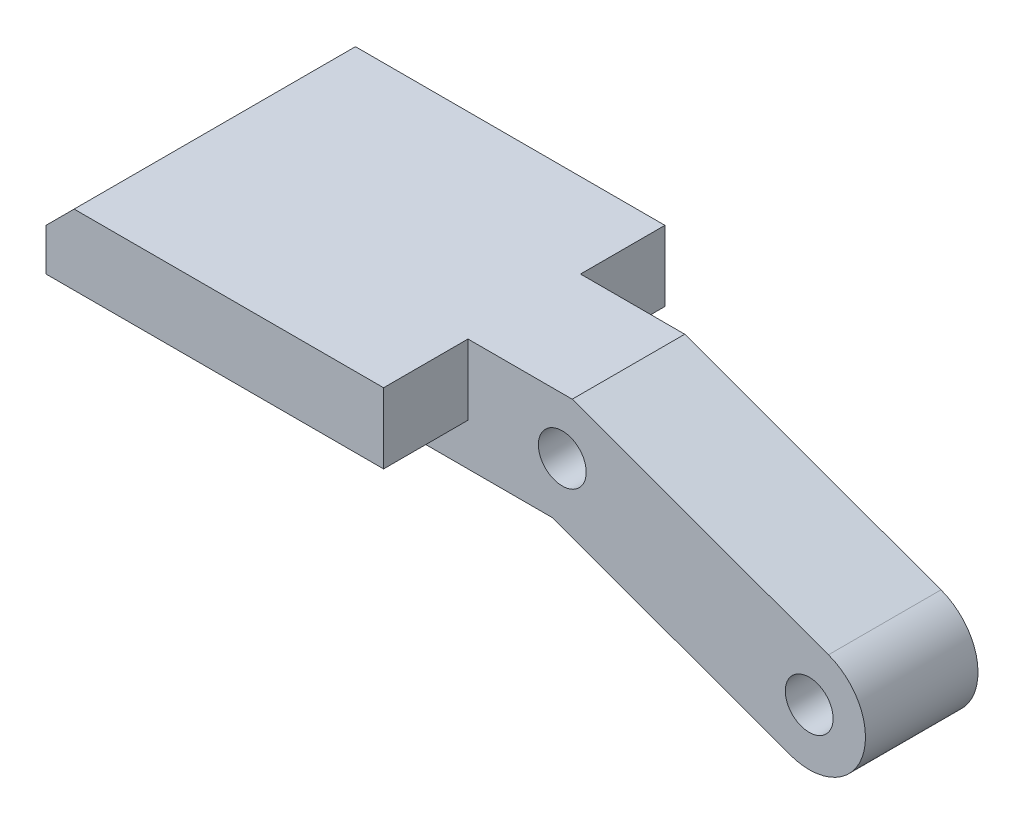
ISO-10303-21;
HEADER;
FILE_DESCRIPTION(('STEP AP214'),'2;1');
FILE_NAME('part.step','',(''),(''),'','','');
FILE_SCHEMA(('AUTOMOTIVE_DESIGN { 1 0 10303 214 1 1 1 1 }'));
ENDSEC;
DATA;
#1=APPLICATION_CONTEXT('core data for automotive mechanical design processes');
#2=APPLICATION_PROTOCOL_DEFINITION('international standard','automotive_design',2000,#1);
#3=PRODUCT_CONTEXT('',#1,'mechanical');
#4=PRODUCT('Part','Part','',(#3));
#5=PRODUCT_RELATED_PRODUCT_CATEGORY('part','',(#4));
#6=PRODUCT_DEFINITION_FORMATION('','',#4);
#7=PRODUCT_DEFINITION_CONTEXT('part definition',#1,'design');
#8=PRODUCT_DEFINITION('design','',#6,#7);
#9=PRODUCT_DEFINITION_SHAPE('','',#8);
#10=(LENGTH_UNIT() NAMED_UNIT(*) SI_UNIT(.MILLI.,.METRE.));
#11=(NAMED_UNIT(*) PLANE_ANGLE_UNIT() SI_UNIT($,.RADIAN.));
#12=(NAMED_UNIT(*) SI_UNIT($,.STERADIAN.) SOLID_ANGLE_UNIT());
#13=UNCERTAINTY_MEASURE_WITH_UNIT(LENGTH_MEASURE(1.E-05),#10,'distance_accuracy_value','');
#14=(GEOMETRIC_REPRESENTATION_CONTEXT(3) GLOBAL_UNCERTAINTY_ASSIGNED_CONTEXT((#13)) GLOBAL_UNIT_ASSIGNED_CONTEXT((#10,
#11,#12)) REPRESENTATION_CONTEXT('',''));
#15=CARTESIAN_POINT('',(0.,0.,0.));
#16=DIRECTION('',(0.,0.,1.));
#17=DIRECTION('',(1.,0.,0.));
#18=AXIS2_PLACEMENT_3D('',#15,#16,#17);
#19=CARTESIAN_POINT('',(0.,0.,8.));
#20=DIRECTION('',(0.,0.,-1.));
#21=DIRECTION('',(-1.,0.,0.));
#22=AXIS2_PLACEMENT_3D('',#19,#20,#21);
#23=CYLINDRICAL_SURFACE('',#22,4.);
#24=CARTESIAN_POINT('',(0.,0.,0.));
#25=DIRECTION('',(0.,0.,1.));
#26=DIRECTION('',(1.,0.,0.));
#27=AXIS2_PLACEMENT_3D('',#24,#25,#26);
#28=CIRCLE('',#27,4.);
#29=CARTESIAN_POINT('',(-1.36808057330268,-3.75877048314363,0.));
#30=VERTEX_POINT('',#29);
#31=CARTESIAN_POINT('',(1.36808057330268,3.75877048314363,0.));
#32=VERTEX_POINT('',#31);
#33=EDGE_CURVE('E190',#30,#32,#28,.T.);
#34=ORIENTED_EDGE('',*,*,#33,.T.);
#35=DIRECTION('',(0.,0.,-1.));
#36=VECTOR('',#35,1.);
#37=CARTESIAN_POINT('',(1.36808057330268,3.75877048314363,8.));
#38=LINE('',#37,#36);
#39=CARTESIAN_POINT('',(1.36808057330268,3.75877048314363,8.));
#40=VERTEX_POINT('',#39);
#41=EDGE_CURVE('E230',#40,#32,#38,.T.);
#42=ORIENTED_EDGE('',*,*,#41,.F.);
#43=CARTESIAN_POINT('',(0.,0.,8.));
#44=DIRECTION('',(0.,0.,1.));
#45=DIRECTION('',(1.,0.,0.));
#46=AXIS2_PLACEMENT_3D('',#43,#44,#45);
#47=CIRCLE('',#46,4.);
#48=CARTESIAN_POINT('',(-1.36808057330268,-3.75877048314363,8.));
#49=VERTEX_POINT('',#48);
#50=EDGE_CURVE('E193',#49,#40,#47,.T.);
#51=ORIENTED_EDGE('',*,*,#50,.F.);
#52=DIRECTION('',(0.,0.,-1.));
#53=VECTOR('',#52,1.);
#54=CARTESIAN_POINT('',(-1.36808057330268,-3.75877048314363,8.));
#55=LINE('',#54,#53);
#56=EDGE_CURVE('E206',#49,#30,#55,.T.);
#57=ORIENTED_EDGE('',*,*,#56,.T.);
#58=EDGE_LOOP('',(#34,#42,#51,#57));
#59=FACE_BOUND('',#58,.T.);
#60=ADVANCED_FACE('F33',(#59),#23,.T.);
#61=CARTESIAN_POINT('',(-16.8481502334469,10.3889362773235,8.));
#62=DIRECTION('',(-0.34202014332567,-0.939692620785908,0.));
#63=DIRECTION('',(0.939692620785908,-0.34202014332567,0.));
#64=AXIS2_PLACEMENT_3D('',#61,#62,#63);
#65=PLANE('',#64);
#66=DIRECTION('',(-0.939692620785908,0.34202014332567,0.));
#67=VECTOR('',#66,1.);
#68=CARTESIAN_POINT('',(-16.8481502334469,10.3889362773235,0.));
#69=LINE('',#68,#67);
#70=CARTESIAN_POINT('',(-16.8481502334469,10.3889362773235,0.));
#71=VERTEX_POINT('',#70);
#72=EDGE_CURVE('E209',#32,#71,#69,.T.);
#73=ORIENTED_EDGE('',*,*,#72,.T.);
#74=DIRECTION('',(0.,0.,-1.));
#75=VECTOR('',#74,1.);
#76=CARTESIAN_POINT('',(-16.8481502334469,10.3889362773235,8.));
#77=LINE('',#76,#75);
#78=CARTESIAN_POINT('',(-16.8481502334469,10.3889362773235,8.));
#79=VERTEX_POINT('',#78);
#80=EDGE_CURVE('E227',#79,#71,#77,.T.);
#81=ORIENTED_EDGE('',*,*,#80,.F.);
#82=DIRECTION('',(-0.939692620785908,0.34202014332567,0.));
#83=VECTOR('',#82,1.);
#84=CARTESIAN_POINT('',(-16.8481502334469,10.3889362773235,8.));
#85=LINE('',#84,#83);
#86=EDGE_CURVE('E196',#40,#79,#85,.T.);
#87=ORIENTED_EDGE('',*,*,#86,.F.);
#88=ORIENTED_EDGE('',*,*,#41,.T.);
#89=EDGE_LOOP('',(#73,#81,#87,#88));
#90=FACE_BOUND('',#89,.T.);
#91=ADVANCED_FACE('F277',(#90),#65,.F.);
#92=CARTESIAN_POINT('',(-48.2587660791146,10.3889362773235,8.));
#93=DIRECTION('',(0.,-1.,0.));
#94=DIRECTION('',(1.,0.,0.));
#95=AXIS2_PLACEMENT_3D('',#92,#93,#94);
#96=PLANE('',#95);
#97=DIRECTION('',(-1.,0.,0.));
#98=VECTOR('',#97,1.);
#99=CARTESIAN_POINT('',(-24.2587660791146,10.3889362773235,-6.));
#100=LINE('',#99,#98);
#101=CARTESIAN_POINT('',(-24.2587660791146,10.3889362773235,-6.));
#102=VERTEX_POINT('',#101);
#103=CARTESIAN_POINT('',(-46.2587660791146,10.3889362773235,-6.));
#104=VERTEX_POINT('',#103);
#105=EDGE_CURVE('E140',#102,#104,#100,.T.);
#106=ORIENTED_EDGE('',*,*,#105,.T.);
#107=DIRECTION('',(0.,0.,1.));
#108=VECTOR('',#107,1.);
#109=CARTESIAN_POINT('',(-46.2587660791146,10.3889362773235,8.));
#110=LINE('',#109,#108);
#111=CARTESIAN_POINT('',(-46.2587660791146,10.3889362773235,14.));
#112=VERTEX_POINT('',#111);
#113=EDGE_CURVE('E41',#104,#112,#110,.T.);
#114=ORIENTED_EDGE('',*,*,#113,.T.);
#115=DIRECTION('',(1.,0.,0.));
#116=VECTOR('',#115,1.);
#117=CARTESIAN_POINT('',(-24.2587660791146,10.3889362773235,14.));
#118=LINE('',#117,#116);
#119=CARTESIAN_POINT('',(-24.2587660791146,10.3889362773235,14.));
#120=VERTEX_POINT('',#119);
#121=EDGE_CURVE('E162',#112,#120,#118,.T.);
#122=ORIENTED_EDGE('',*,*,#121,.T.);
#123=DIRECTION('',(0.,0.,-1.));
#124=VECTOR('',#123,1.);
#125=CARTESIAN_POINT('',(-24.2587660791146,10.3889362773235,-6.));
#126=LINE('',#125,#124);
#127=CARTESIAN_POINT('',(-24.2587660791146,10.3889362773235,8.));
#128=VERTEX_POINT('',#127);
#129=EDGE_CURVE('E165',#120,#128,#126,.T.);
#130=ORIENTED_EDGE('',*,*,#129,.T.);
#131=DIRECTION('',(-1.,0.,0.));
#132=VECTOR('',#131,1.);
#133=CARTESIAN_POINT('',(-48.2587660791146,10.3889362773235,8.));
#134=LINE('',#133,#132);
#135=EDGE_CURVE('E199',#79,#128,#134,.T.);
#136=ORIENTED_EDGE('',*,*,#135,.F.);
#137=ORIENTED_EDGE('',*,*,#80,.T.);
#138=DIRECTION('',(-1.,0.,0.));
#139=VECTOR('',#138,1.);
#140=CARTESIAN_POINT('',(-48.2587660791146,10.3889362773235,0.));
#141=LINE('',#140,#139);
#142=CARTESIAN_POINT('',(-24.2587660791146,10.3889362773235,0.));
#143=VERTEX_POINT('',#142);
#144=EDGE_CURVE('E211',#71,#143,#141,.T.);
#145=ORIENTED_EDGE('',*,*,#144,.T.);
#146=EDGE_CURVE('E164',#143,#102,#126,.T.);
#147=ORIENTED_EDGE('',*,*,#146,.T.);
#148=EDGE_LOOP('',(#106,#114,#122,#130,#136,#137,#145,#147));
#149=FACE_BOUND('',#148,.T.);
#150=ADVANCED_FACE('F282',(#149),#96,.F.);
#151=CARTESIAN_POINT('',(-48.2587660791146,2.38893627732351,8.));
#152=DIRECTION('',(1.,0.,0.));
#153=DIRECTION('',(0.,1.,0.));
#154=AXIS2_PLACEMENT_3D('',#151,#152,#153);
#155=PLANE('',#154);
#156=DIRECTION('',(0.,1.,0.));
#157=VECTOR('',#156,1.);
#158=CARTESIAN_POINT('',(-48.2587660791146,5.38893627732351,14.));
#159=LINE('',#158,#157);
#160=CARTESIAN_POINT('',(-48.2587660791146,5.38893627732351,14.));
#161=VERTEX_POINT('',#160);
#162=CARTESIAN_POINT('',(-48.2587660791146,8.38893627732351,14.));
#163=VERTEX_POINT('',#162);
#164=EDGE_CURVE('E132',#161,#163,#159,.T.);
#165=ORIENTED_EDGE('',*,*,#164,.T.);
#166=DIRECTION('',(0.,0.,-1.));
#167=VECTOR('',#166,1.);
#168=CARTESIAN_POINT('',(-48.2587660791146,8.38893627732351,8.));
#169=LINE('',#168,#167);
#170=CARTESIAN_POINT('',(-48.2587660791146,8.38893627732351,-6.));
#171=VERTEX_POINT('',#170);
#172=EDGE_CURVE('E239',#163,#171,#169,.T.);
#173=ORIENTED_EDGE('',*,*,#172,.T.);
#174=DIRECTION('',(0.,1.,0.));
#175=VECTOR('',#174,1.);
#176=CARTESIAN_POINT('',(-48.2587660791146,5.38893627732351,-6.));
#177=LINE('',#176,#175);
#178=CARTESIAN_POINT('',(-48.2587660791146,5.38893627732351,-6.));
#179=VERTEX_POINT('',#178);
#180=EDGE_CURVE('E169',#179,#171,#177,.T.);
#181=ORIENTED_EDGE('',*,*,#180,.F.);
#182=DIRECTION('',(0.,0.,1.));
#183=VECTOR('',#182,1.);
#184=CARTESIAN_POINT('',(-48.2587660791146,5.38893627732351,-6.));
#185=LINE('',#184,#183);
#186=CARTESIAN_POINT('',(-48.2587660791146,5.38893627732351,0.));
#187=VERTEX_POINT('',#186);
#188=EDGE_CURVE('E139',#179,#187,#185,.T.);
#189=ORIENTED_EDGE('',*,*,#188,.T.);
#190=DIRECTION('',(0.,-1.,0.));
#191=VECTOR('',#190,1.);
#192=CARTESIAN_POINT('',(-48.2587660791146,2.38893627732351,0.));
#193=LINE('',#192,#191);
#194=CARTESIAN_POINT('',(-48.2587660791146,2.38893627732351,0.));
#195=VERTEX_POINT('',#194);
#196=EDGE_CURVE('E214',#187,#195,#193,.T.);
#197=ORIENTED_EDGE('',*,*,#196,.T.);
#198=DIRECTION('',(0.,0.,-1.));
#199=VECTOR('',#198,1.);
#200=CARTESIAN_POINT('',(-48.2587660791146,2.38893627732351,8.));
#201=LINE('',#200,#199);
#202=CARTESIAN_POINT('',(-48.2587660791146,2.38893627732351,8.));
#203=VERTEX_POINT('',#202);
#204=EDGE_CURVE('E224',#203,#195,#201,.T.);
#205=ORIENTED_EDGE('',*,*,#204,.F.);
#206=DIRECTION('',(0.,-1.,0.));
#207=VECTOR('',#206,1.);
#208=CARTESIAN_POINT('',(-48.2587660791146,2.38893627732351,8.));
#209=LINE('',#208,#207);
#210=CARTESIAN_POINT('',(-48.2587660791146,5.38893627732351,8.));
#211=VERTEX_POINT('',#210);
#212=EDGE_CURVE('E135',#211,#203,#209,.T.);
#213=ORIENTED_EDGE('',*,*,#212,.F.);
#214=EDGE_CURVE('E128',#211,#161,#185,.T.);
#215=ORIENTED_EDGE('',*,*,#214,.T.);
#216=EDGE_LOOP('',(#165,#173,#181,#189,#197,#205,#213,#215));
#217=FACE_BOUND('',#216,.T.);
#218=ADVANCED_FACE('F130',(#217),#155,.F.);
#219=CARTESIAN_POINT('',(-18.2587660791146,2.38893627732351,8.));
#220=DIRECTION('',(0.,1.,0.));
#221=DIRECTION('',(-1.,0.,0.));
#222=AXIS2_PLACEMENT_3D('',#219,#220,#221);
#223=PLANE('',#222);
#224=DIRECTION('',(1.,0.,0.));
#225=VECTOR('',#224,1.);
#226=CARTESIAN_POINT('',(-18.2587660791146,2.38893627732351,0.));
#227=LINE('',#226,#225);
#228=CARTESIAN_POINT('',(-18.2587660791146,2.38893627732351,0.));
#229=VERTEX_POINT('',#228);
#230=EDGE_CURVE('E216',#195,#229,#227,.T.);
#231=ORIENTED_EDGE('',*,*,#230,.T.);
#232=DIRECTION('',(0.,0.,-1.));
#233=VECTOR('',#232,1.);
#234=CARTESIAN_POINT('',(-18.2587660791146,2.38893627732351,8.));
#235=LINE('',#234,#233);
#236=CARTESIAN_POINT('',(-18.2587660791146,2.38893627732351,8.));
#237=VERTEX_POINT('',#236);
#238=EDGE_CURVE('E221',#237,#229,#235,.T.);
#239=ORIENTED_EDGE('',*,*,#238,.F.);
#240=DIRECTION('',(1.,0.,0.));
#241=VECTOR('',#240,1.);
#242=CARTESIAN_POINT('',(-18.2587660791146,2.38893627732351,8.));
#243=LINE('',#242,#241);
#244=EDGE_CURVE('E202',#203,#237,#243,.T.);
#245=ORIENTED_EDGE('',*,*,#244,.F.);
#246=ORIENTED_EDGE('',*,*,#204,.T.);
#247=EDGE_LOOP('',(#231,#239,#245,#246));
#248=FACE_BOUND('',#247,.T.);
#249=ADVANCED_FACE('F257',(#248),#223,.F.);
#250=CARTESIAN_POINT('',(-1.36808057330268,-3.75877048314363,8.));
#251=DIRECTION('',(0.34202014332567,0.939692620785908,0.));
#252=DIRECTION('',(-0.939692620785908,0.34202014332567,0.));
#253=AXIS2_PLACEMENT_3D('',#250,#251,#252);
#254=PLANE('',#253);
#255=DIRECTION('',(0.939692620785908,-0.34202014332567,0.));
#256=VECTOR('',#255,1.);
#257=CARTESIAN_POINT('',(-1.36808057330268,-3.75877048314363,0.));
#258=LINE('',#257,#256);
#259=EDGE_CURVE('E197',#229,#30,#258,.T.);
#260=ORIENTED_EDGE('',*,*,#259,.T.);
#261=ORIENTED_EDGE('',*,*,#56,.F.);
#262=DIRECTION('',(0.939692620785908,-0.34202014332567,0.));
#263=VECTOR('',#262,1.);
#264=CARTESIAN_POINT('',(-1.36808057330268,-3.75877048314363,8.));
#265=LINE('',#264,#263);
#266=EDGE_CURVE('E204',#237,#49,#265,.T.);
#267=ORIENTED_EDGE('',*,*,#266,.F.);
#268=ORIENTED_EDGE('',*,*,#238,.T.);
#269=EDGE_LOOP('',(#260,#261,#267,#268));
#270=FACE_BOUND('',#269,.T.);
#271=ADVANCED_FACE('F261',(#270),#254,.F.);
#272=CARTESIAN_POINT('',(0.,0.,8.));
#273=DIRECTION('',(0.,0.,1.));
#274=DIRECTION('',(1.,0.,0.));
#275=AXIS2_PLACEMENT_3D('',#272,#273,#274);
#276=PLANE('',#275);
#277=DIRECTION('',(0.,1.,0.));
#278=VECTOR('',#277,1.);
#279=CARTESIAN_POINT('',(-24.2587660791146,0.,8.));
#280=LINE('',#279,#278);
#281=CARTESIAN_POINT('',(-24.2587660791146,5.38893627732351,8.));
#282=VERTEX_POINT('',#281);
#283=EDGE_CURVE('E177',#282,#128,#280,.T.);
#284=ORIENTED_EDGE('',*,*,#283,.F.);
#285=DIRECTION('',(1.,0.,0.));
#286=VECTOR('',#285,1.);
#287=CARTESIAN_POINT('',(0.,5.38893627732351,8.));
#288=LINE('',#287,#286);
#289=EDGE_CURVE('E171',#211,#282,#288,.T.);
#290=ORIENTED_EDGE('',*,*,#289,.F.);
#291=ORIENTED_EDGE('',*,*,#212,.T.);
#292=ORIENTED_EDGE('',*,*,#244,.T.);
#293=ORIENTED_EDGE('',*,*,#266,.T.);
#294=ORIENTED_EDGE('',*,*,#50,.T.);
#295=ORIENTED_EDGE('',*,*,#86,.T.);
#296=ORIENTED_EDGE('',*,*,#135,.T.);
#297=EDGE_LOOP('',(#284,#290,#291,#292,#293,#294,#295,#296));
#298=FACE_BOUND('',#297,.T.);
#299=CARTESIAN_POINT('',(-17.5534581562808,6.38893627732351,8.));
#300=DIRECTION('',(0.,0.,1.));
#301=DIRECTION('',(1.,0.,0.));
#302=AXIS2_PLACEMENT_3D('',#299,#300,#301);
#303=CIRCLE('',#302,1.7);
#304=CARTESIAN_POINT('',(-15.8534581562808,6.38893627732351,8.));
#305=VERTEX_POINT('',#304);
#306=EDGE_CURVE('E180',#305,#305,#303,.T.);
#307=ORIENTED_EDGE('',*,*,#306,.F.);
#308=EDGE_LOOP('',(#307));
#309=FACE_BOUND('',#308,.T.);
#310=CARTESIAN_POINT('',(0.,0.,8.));
#311=DIRECTION('',(0.,0.,1.));
#312=DIRECTION('',(1.,0.,0.));
#313=AXIS2_PLACEMENT_3D('',#310,#311,#312);
#314=CIRCLE('',#313,1.7);
#315=CARTESIAN_POINT('',(1.7,0.,8.));
#316=VERTEX_POINT('',#315);
#317=EDGE_CURVE('E184',#316,#316,#314,.T.);
#318=ORIENTED_EDGE('',*,*,#317,.F.);
#319=EDGE_LOOP('',(#318));
#320=FACE_BOUND('',#319,.T.);
#321=ADVANCED_FACE('F265',(#298,#309,#320),#276,.T.);
#322=CARTESIAN_POINT('',(0.,0.,0.));
#323=DIRECTION('',(0.,0.,1.));
#324=DIRECTION('',(1.,0.,0.));
#325=AXIS2_PLACEMENT_3D('',#322,#323,#324);
#326=PLANE('',#325);
#327=CARTESIAN_POINT('',(-17.5534581562808,6.38893627732351,0.));
#328=DIRECTION('',(0.,0.,1.));
#329=DIRECTION('',(1.,0.,0.));
#330=AXIS2_PLACEMENT_3D('',#327,#328,#329);
#331=CIRCLE('',#330,1.7);
#332=CARTESIAN_POINT('',(-15.8534581562808,6.38893627732351,0.));
#333=VERTEX_POINT('',#332);
#334=EDGE_CURVE('E181',#333,#333,#331,.T.);
#335=ORIENTED_EDGE('',*,*,#334,.T.);
#336=EDGE_LOOP('',(#335));
#337=FACE_BOUND('',#336,.T.);
#338=CARTESIAN_POINT('',(0.,0.,0.));
#339=DIRECTION('',(0.,0.,1.));
#340=DIRECTION('',(1.,0.,0.));
#341=AXIS2_PLACEMENT_3D('',#338,#339,#340);
#342=CIRCLE('',#341,1.7);
#343=CARTESIAN_POINT('',(1.7,0.,0.));
#344=VERTEX_POINT('',#343);
#345=EDGE_CURVE('E187',#344,#344,#342,.T.);
#346=ORIENTED_EDGE('',*,*,#345,.T.);
#347=EDGE_LOOP('',(#346));
#348=FACE_BOUND('',#347,.T.);
#349=DIRECTION('',(1.,0.,0.));
#350=VECTOR('',#349,1.);
#351=CARTESIAN_POINT('',(0.,5.38893627732351,0.));
#352=LINE('',#351,#350);
#353=CARTESIAN_POINT('',(-24.2587660791146,5.38893627732351,0.));
#354=VERTEX_POINT('',#353);
#355=EDGE_CURVE('E233',#187,#354,#352,.T.);
#356=ORIENTED_EDGE('',*,*,#355,.T.);
#357=DIRECTION('',(0.,1.,0.));
#358=VECTOR('',#357,1.);
#359=CARTESIAN_POINT('',(-24.2587660791146,0.,0.));
#360=LINE('',#359,#358);
#361=EDGE_CURVE('E236',#354,#143,#360,.T.);
#362=ORIENTED_EDGE('',*,*,#361,.T.);
#363=ORIENTED_EDGE('',*,*,#144,.F.);
#364=ORIENTED_EDGE('',*,*,#72,.F.);
#365=ORIENTED_EDGE('',*,*,#33,.F.);
#366=ORIENTED_EDGE('',*,*,#259,.F.);
#367=ORIENTED_EDGE('',*,*,#230,.F.);
#368=ORIENTED_EDGE('',*,*,#196,.F.);
#369=EDGE_LOOP('',(#356,#362,#363,#364,#365,#366,#367,#368));
#370=FACE_BOUND('',#369,.T.);
#371=ADVANCED_FACE('F252',(#337,#348,#370),#326,.F.);
#372=CARTESIAN_POINT('',(0.,0.,0.));
#373=DIRECTION('',(0.,0.,1.));
#374=DIRECTION('',(1.,0.,0.));
#375=AXIS2_PLACEMENT_3D('',#372,#373,#374);
#376=CYLINDRICAL_SURFACE('',#375,1.7);
#377=ORIENTED_EDGE('',*,*,#345,.F.);
#378=EDGE_LOOP('',(#377));
#379=FACE_BOUND('',#378,.T.);
#380=ORIENTED_EDGE('',*,*,#317,.T.);
#381=EDGE_LOOP('',(#380));
#382=FACE_BOUND('',#381,.T.);
#383=ADVANCED_FACE('F296',(#379,#382),#376,.F.);
#384=CARTESIAN_POINT('',(-17.5534581562808,6.38893627732351,0.));
#385=DIRECTION('',(0.,0.,1.));
#386=DIRECTION('',(1.,0.,0.));
#387=AXIS2_PLACEMENT_3D('',#384,#385,#386);
#388=CYLINDRICAL_SURFACE('',#387,1.7);
#389=ORIENTED_EDGE('',*,*,#334,.F.);
#390=EDGE_LOOP('',(#389));
#391=FACE_BOUND('',#390,.T.);
#392=ORIENTED_EDGE('',*,*,#306,.T.);
#393=EDGE_LOOP('',(#392));
#394=FACE_BOUND('',#393,.T.);
#395=ADVANCED_FACE('F302',(#391,#394),#388,.F.);
#396=CARTESIAN_POINT('',(-24.2587660791146,5.38893627732351,-6.));
#397=DIRECTION('',(0.,0.,-1.));
#398=DIRECTION('',(-1.,0.,0.));
#399=AXIS2_PLACEMENT_3D('',#396,#397,#398);
#400=PLANE('',#399);
#401=ORIENTED_EDGE('',*,*,#180,.T.);
#402=DIRECTION('',(-0.707106781186548,-0.707106781186548,0.));
#403=VECTOR('',#402,1.);
#404=CARTESIAN_POINT('',(-37.7587660791146,18.8889362773235,-6.));
#405=LINE('',#404,#403);
#406=EDGE_CURVE('E55',#171,#104,#405,.F.);
#407=ORIENTED_EDGE('',*,*,#406,.T.);
#408=ORIENTED_EDGE('',*,*,#105,.F.);
#409=DIRECTION('',(0.,1.,0.));
#410=VECTOR('',#409,1.);
#411=CARTESIAN_POINT('',(-24.2587660791146,5.38893627732351,-6.));
#412=LINE('',#411,#410);
#413=CARTESIAN_POINT('',(-24.2587660791146,5.38893627732351,-6.));
#414=VERTEX_POINT('',#413);
#415=EDGE_CURVE('E172',#414,#102,#412,.T.);
#416=ORIENTED_EDGE('',*,*,#415,.F.);
#417=DIRECTION('',(-1.,0.,0.));
#418=VECTOR('',#417,1.);
#419=CARTESIAN_POINT('',(-24.2587660791146,5.38893627732351,-6.));
#420=LINE('',#419,#418);
#421=EDGE_CURVE('E149',#414,#179,#420,.T.);
#422=ORIENTED_EDGE('',*,*,#421,.T.);
#423=EDGE_LOOP('',(#401,#407,#408,#416,#422));
#424=FACE_BOUND('',#423,.T.);
#425=ADVANCED_FACE('F243',(#424),#400,.T.);
#426=CARTESIAN_POINT('',(0.,5.38893627732351,0.));
#427=DIRECTION('',(0.,-1.,0.));
#428=DIRECTION('',(0.,0.,-1.));
#429=AXIS2_PLACEMENT_3D('',#426,#427,#428);
#430=PLANE('',#429);
#431=ORIENTED_EDGE('',*,*,#355,.F.);
#432=ORIENTED_EDGE('',*,*,#188,.F.);
#433=ORIENTED_EDGE('',*,*,#421,.F.);
#434=DIRECTION('',(0.,0.,-1.));
#435=VECTOR('',#434,1.);
#436=CARTESIAN_POINT('',(-24.2587660791146,5.38893627732351,-6.));
#437=LINE('',#436,#435);
#438=EDGE_CURVE('E155',#354,#414,#437,.T.);
#439=ORIENTED_EDGE('',*,*,#438,.F.);
#440=EDGE_LOOP('',(#431,#432,#433,#439));
#441=FACE_BOUND('',#440,.T.);
#442=ADVANCED_FACE('F248',(#441),#430,.T.);
#443=CARTESIAN_POINT('',(-24.2587660791146,5.38893627732351,-6.));
#444=DIRECTION('',(1.,0.,0.));
#445=DIRECTION('',(0.,0.,-1.));
#446=AXIS2_PLACEMENT_3D('',#443,#444,#445);
#447=PLANE('',#446);
#448=ORIENTED_EDGE('',*,*,#361,.F.);
#449=ORIENTED_EDGE('',*,*,#438,.T.);
#450=ORIENTED_EDGE('',*,*,#415,.T.);
#451=ORIENTED_EDGE('',*,*,#146,.F.);
#452=EDGE_LOOP('',(#448,#449,#450,#451));
#453=FACE_BOUND('',#452,.T.);
#454=ADVANCED_FACE('F311',(#453),#447,.T.);
#455=CARTESIAN_POINT('',(-24.2587660791146,5.38893627732351,14.));
#456=VERTEX_POINT('',#455);
#457=EDGE_CURVE('E154',#456,#282,#437,.T.);
#458=ORIENTED_EDGE('',*,*,#457,.T.);
#459=ORIENTED_EDGE('',*,*,#283,.T.);
#460=ORIENTED_EDGE('',*,*,#129,.F.);
#461=DIRECTION('',(0.,1.,0.));
#462=VECTOR('',#461,1.);
#463=CARTESIAN_POINT('',(-24.2587660791146,5.38893627732351,14.));
#464=LINE('',#463,#462);
#465=EDGE_CURVE('E148',#456,#120,#464,.T.);
#466=ORIENTED_EDGE('',*,*,#465,.F.);
#467=EDGE_LOOP('',(#458,#459,#460,#466));
#468=FACE_BOUND('',#467,.T.);
#469=ADVANCED_FACE('F269',(#468),#447,.T.);
#470=CARTESIAN_POINT('',(-24.2587660791146,5.38893627732351,14.));
#471=DIRECTION('',(0.,0.,1.));
#472=DIRECTION('',(1.,0.,0.));
#473=AXIS2_PLACEMENT_3D('',#470,#471,#472);
#474=PLANE('',#473);
#475=ORIENTED_EDGE('',*,*,#121,.F.);
#476=DIRECTION('',(0.707106781186548,0.707106781186548,0.));
#477=VECTOR('',#476,1.);
#478=CARTESIAN_POINT('',(-37.7587660791146,18.8889362773235,14.));
#479=LINE('',#478,#477);
#480=EDGE_CURVE('E11',#112,#163,#479,.F.);
#481=ORIENTED_EDGE('',*,*,#480,.T.);
#482=ORIENTED_EDGE('',*,*,#164,.F.);
#483=DIRECTION('',(1.,0.,0.));
#484=VECTOR('',#483,1.);
#485=CARTESIAN_POINT('',(-24.2587660791146,5.38893627732351,14.));
#486=LINE('',#485,#484);
#487=EDGE_CURVE('E146',#161,#456,#486,.T.);
#488=ORIENTED_EDGE('',*,*,#487,.T.);
#489=ORIENTED_EDGE('',*,*,#465,.T.);
#490=EDGE_LOOP('',(#475,#481,#482,#488,#489));
#491=FACE_BOUND('',#490,.T.);
#492=ADVANCED_FACE('F144',(#491),#474,.T.);
#493=ORIENTED_EDGE('',*,*,#214,.F.);
#494=ORIENTED_EDGE('',*,*,#289,.T.);
#495=ORIENTED_EDGE('',*,*,#457,.F.);
#496=ORIENTED_EDGE('',*,*,#487,.F.);
#497=EDGE_LOOP('',(#493,#494,#495,#496));
#498=FACE_BOUND('',#497,.T.);
#499=ADVANCED_FACE('F152',(#498),#430,.T.);
#500=CARTESIAN_POINT('',(-48.2587660791146,8.38893627732351,8.));
#501=DIRECTION('',(0.707106781186548,-0.707106781186548,0.));
#502=DIRECTION('',(0.,0.,-1.));
#503=AXIS2_PLACEMENT_3D('',#500,#501,#502);
#504=PLANE('',#503);
#505=ORIENTED_EDGE('',*,*,#480,.F.);
#506=ORIENTED_EDGE('',*,*,#113,.F.);
#507=ORIENTED_EDGE('',*,*,#406,.F.);
#508=ORIENTED_EDGE('',*,*,#172,.F.);
#509=EDGE_LOOP('',(#505,#506,#507,#508));
#510=FACE_BOUND('',#509,.T.);
#511=ADVANCED_FACE('F35',(#510),#504,.F.);
#512=CLOSED_SHELL('',(#60,#91,#150,#218,#249,#271,#321,#371,#383,#395,#425,#442,#454,#469,#492,
#499,#511));
#513=MANIFOLD_SOLID_BREP('B2',#512);
#514=ADVANCED_BREP_SHAPE_REPRESENTATION('',(#18,#513),#14);
#515=SHAPE_DEFINITION_REPRESENTATION(#9,#514);
ENDSEC;
END-ISO-10303-21;
